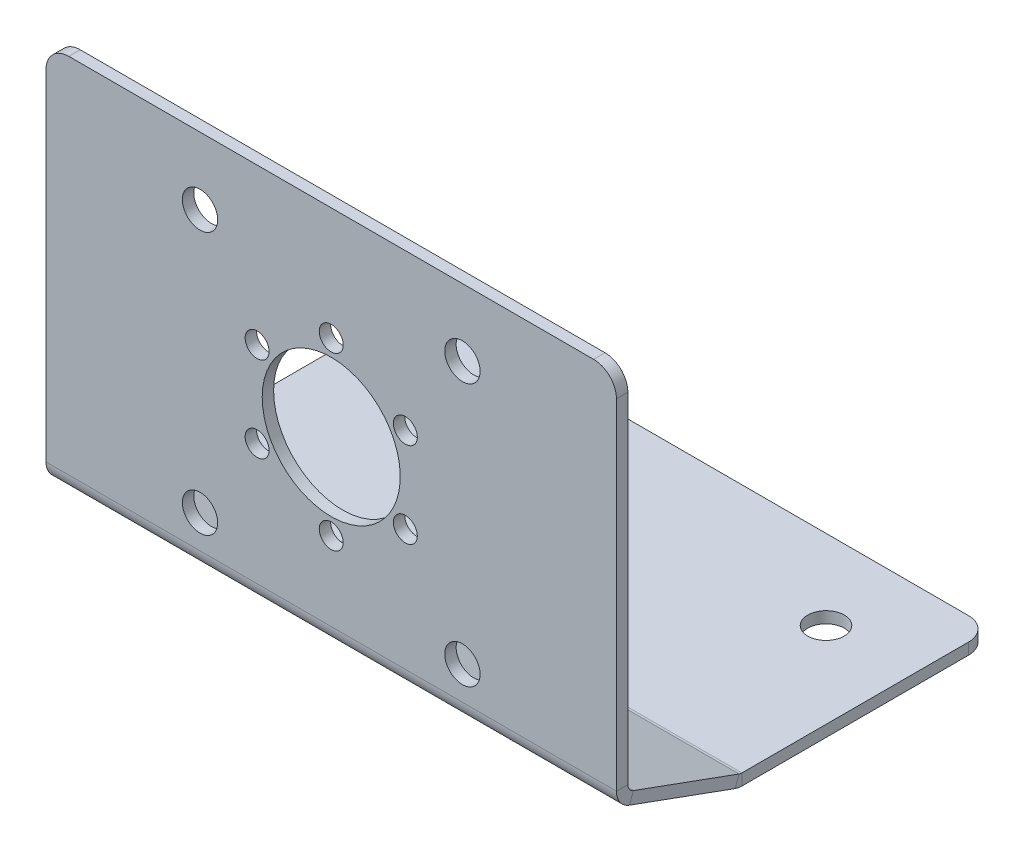
ISO-10303-21;
HEADER;
FILE_DESCRIPTION(('STEP AP214'),'2;1');
FILE_NAME('part.step','',(''),(''),'','','');
FILE_SCHEMA(('AUTOMOTIVE_DESIGN { 1 0 10303 214 1 1 1 1 }'));
ENDSEC;
DATA;
#1=APPLICATION_CONTEXT('core data for automotive mechanical design processes');
#2=APPLICATION_PROTOCOL_DEFINITION('international standard','automotive_design',2000,#1);
#3=PRODUCT_CONTEXT('',#1,'mechanical');
#4=PRODUCT('Part','Part','',(#3));
#5=PRODUCT_RELATED_PRODUCT_CATEGORY('part','',(#4));
#6=PRODUCT_DEFINITION_FORMATION('','',#4);
#7=PRODUCT_DEFINITION_CONTEXT('part definition',#1,'design');
#8=PRODUCT_DEFINITION('design','',#6,#7);
#9=PRODUCT_DEFINITION_SHAPE('','',#8);
#10=(LENGTH_UNIT() NAMED_UNIT(*) SI_UNIT(.MILLI.,.METRE.));
#11=(NAMED_UNIT(*) PLANE_ANGLE_UNIT() SI_UNIT($,.RADIAN.));
#12=(NAMED_UNIT(*) SI_UNIT($,.STERADIAN.) SOLID_ANGLE_UNIT());
#13=UNCERTAINTY_MEASURE_WITH_UNIT(LENGTH_MEASURE(1.E-05),#10,'distance_accuracy_value','');
#14=(GEOMETRIC_REPRESENTATION_CONTEXT(3) GLOBAL_UNCERTAINTY_ASSIGNED_CONTEXT((#13)) GLOBAL_UNIT_ASSIGNED_CONTEXT((#10,
#11,#12)) REPRESENTATION_CONTEXT('',''));
#15=CARTESIAN_POINT('',(0.,0.,0.));
#16=DIRECTION('',(0.,0.,1.));
#17=DIRECTION('',(1.,0.,0.));
#18=AXIS2_PLACEMENT_3D('',#15,#16,#17);
#19=CARTESIAN_POINT('',(-25.,-0.93969262078591,11.3420201433257));
#20=DIRECTION('',(1.,0.,0.));
#21=DIRECTION('',(0.,0.,-1.));
#22=AXIS2_PLACEMENT_3D('',#19,#20,#21);
#23=PLANE('',#22);
#24=DIRECTION('',(0.,-0.93969262078591,0.342020143325665));
#25=VECTOR('',#24,1.);
#26=CARTESIAN_POINT('',(-25.,3.41480679309383,20.3821045558257));
#27=LINE('',#26,#25);
#28=CARTESIAN_POINT('',(-25.,3.41480679309383,20.3821045558257));
#29=VERTEX_POINT('',#28);
#30=CARTESIAN_POINT('',(-25.,2.47511417230793,20.7241246991514));
#31=VERTEX_POINT('',#30);
#32=EDGE_CURVE('E248',#29,#31,#27,.T.);
#33=ORIENTED_EDGE('',*,*,#32,.F.);
#34=DIRECTION('',(0.,-0.342020143325663,-0.939692620785911));
#35=VECTOR('',#34,1.);
#36=CARTESIAN_POINT('',(-25.,0.,11.));
#37=LINE('',#36,#35);
#38=CARTESIAN_POINT('',(-25.,0.0444224155290982,11.1220495835838));
#39=VERTEX_POINT('',#38);
#40=EDGE_CURVE('E269',#29,#39,#37,.T.);
#41=ORIENTED_EDGE('',*,*,#40,.T.);
#42=DIRECTION('',(0.,-0.93969262078591,0.342020143325663));
#43=VECTOR('',#42,1.);
#44=CARTESIAN_POINT('',(-25.,0.0444224155290987,11.1220495835838));
#45=LINE('',#44,#43);
#46=CARTESIAN_POINT('',(-25.,-0.895270205256812,11.4640697269095));
#47=VERTEX_POINT('',#46);
#48=EDGE_CURVE('E252',#39,#47,#45,.T.);
#49=ORIENTED_EDGE('',*,*,#48,.T.);
#50=DIRECTION('',(0.,-0.342020143325663,-0.939692620785911));
#51=VECTOR('',#50,1.);
#52=CARTESIAN_POINT('',(-25.,-0.93969262078591,11.3420201433257));
#53=LINE('',#52,#51);
#54=EDGE_CURVE('E270',#31,#47,#53,.T.);
#55=ORIENTED_EDGE('',*,*,#54,.F.);
#56=EDGE_LOOP('',(#33,#41,#49,#55));
#57=FACE_BOUND('',#56,.T.);
#58=ADVANCED_FACE('F64',(#57),#23,.F.);
#59=CARTESIAN_POINT('',(25.,2.65151888413355,21.2087926615777));
#60=DIRECTION('',(-1.,0.,0.));
#61=DIRECTION('',(0.,0.,1.));
#62=AXIS2_PLACEMENT_3D('',#59,#60,#61);
#63=PLANE('',#62);
#64=DIRECTION('',(0.,-0.93969262078591,0.342020143325665));
#65=VECTOR('',#64,1.);
#66=CARTESIAN_POINT('',(25.,3.41480679309383,20.3821045558257));
#67=LINE('',#66,#65);
#68=CARTESIAN_POINT('',(25.,3.41480679309384,20.3821045558257));
#69=VERTEX_POINT('',#68);
#70=CARTESIAN_POINT('',(25.,2.47511417230792,20.7241246991514));
#71=VERTEX_POINT('',#70);
#72=EDGE_CURVE('E237',#69,#71,#67,.T.);
#73=ORIENTED_EDGE('',*,*,#72,.T.);
#74=DIRECTION('',(0.,0.342020143325663,0.939692620785911));
#75=VECTOR('',#74,1.);
#76=CARTESIAN_POINT('',(25.,2.65151888413355,21.2087926615777));
#77=LINE('',#76,#75);
#78=CARTESIAN_POINT('',(25.,-0.895270205256812,11.4640697269095));
#79=VERTEX_POINT('',#78);
#80=EDGE_CURVE('E273',#79,#71,#77,.T.);
#81=ORIENTED_EDGE('',*,*,#80,.F.);
#82=DIRECTION('',(0.,-0.93969262078591,0.342020143325663));
#83=VECTOR('',#82,1.);
#84=CARTESIAN_POINT('',(25.,0.0444224155290987,11.1220495835838));
#85=LINE('',#84,#83);
#86=CARTESIAN_POINT('',(25.,0.0444224155291019,11.1220495835838));
#87=VERTEX_POINT('',#86);
#88=EDGE_CURVE('E259',#87,#79,#85,.T.);
#89=ORIENTED_EDGE('',*,*,#88,.F.);
#90=DIRECTION('',(0.,0.342020143325663,0.939692620785911));
#91=VECTOR('',#90,1.);
#92=CARTESIAN_POINT('',(25.,3.59121150491946,20.8667725182521));
#93=LINE('',#92,#91);
#94=EDGE_CURVE('E274',#87,#69,#93,.T.);
#95=ORIENTED_EDGE('',*,*,#94,.T.);
#96=EDGE_LOOP('',(#73,#81,#89,#95));
#97=FACE_BOUND('',#96,.T.);
#98=ADVANCED_FACE('F544',(#97),#63,.F.);
#99=CARTESIAN_POINT('',(0.,-4.47502447406183,1.62877570617124));
#100=DIRECTION('',(0.,0.939692620785911,-0.342020143325663));
#101=DIRECTION('',(0.,0.342020143325663,0.939692620785911));
#102=AXIS2_PLACEMENT_3D('',#99,#100,#101);
#103=PLANE('',#102);
#104=DIRECTION('',(1.,0.,0.));
#105=VECTOR('',#104,1.);
#106=CARTESIAN_POINT('',(25.,2.47511417230792,20.7241246991514));
#107=LINE('',#106,#105);
#108=EDGE_CURVE('E189',#71,#31,#107,.F.);
#109=ORIENTED_EDGE('',*,*,#108,.T.);
#110=ORIENTED_EDGE('',*,*,#54,.T.);
#111=DIRECTION('',(-1.,0.,0.));
#112=VECTOR('',#111,1.);
#113=CARTESIAN_POINT('',(0.,-0.895270205256813,11.4640697269095));
#114=LINE('',#113,#112);
#115=EDGE_CURVE('E263',#79,#47,#114,.T.);
#116=ORIENTED_EDGE('',*,*,#115,.F.);
#117=ORIENTED_EDGE('',*,*,#80,.T.);
#118=EDGE_LOOP('',(#109,#110,#116,#117));
#119=FACE_BOUND('',#118,.T.);
#120=ADVANCED_FACE('F550',(#119),#103,.F.);
#121=CARTESIAN_POINT('',(0.,-3.53533185327592,1.28675556284558));
#122=DIRECTION('',(0.,0.939692620785911,-0.342020143325663));
#123=DIRECTION('',(0.,0.342020143325663,0.939692620785911));
#124=AXIS2_PLACEMENT_3D('',#121,#122,#123);
#125=PLANE('',#124);
#126=ORIENTED_EDGE('',*,*,#40,.F.);
#127=DIRECTION('',(1.,0.,0.));
#128=VECTOR('',#127,1.);
#129=CARTESIAN_POINT('',(25.,3.41480679309383,20.3821045558257));
#130=LINE('',#129,#128);
#131=EDGE_CURVE('E242',#69,#29,#130,.F.);
#132=ORIENTED_EDGE('',*,*,#131,.F.);
#133=ORIENTED_EDGE('',*,*,#94,.F.);
#134=DIRECTION('',(1.,0.,0.));
#135=VECTOR('',#134,1.);
#136=CARTESIAN_POINT('',(-25.,0.0444224155290987,11.1220495835838));
#137=LINE('',#136,#135);
#138=EDGE_CURVE('E256',#39,#87,#137,.T.);
#139=ORIENTED_EDGE('',*,*,#138,.F.);
#140=EDGE_LOOP('',(#126,#132,#133,#139));
#141=FACE_BOUND('',#140,.T.);
#142=ADVANCED_FACE('F603',(#141),#125,.T.);
#143=CARTESIAN_POINT('',(25.,-1.,-11.));
#144=DIRECTION('',(1.,0.,0.));
#145=DIRECTION('',(0.,0.,-1.));
#146=AXIS2_PLACEMENT_3D('',#143,#144,#145);
#147=PLANE('',#146);
#148=DIRECTION('',(0.,0.,-1.));
#149=VECTOR('',#148,1.);
#150=CARTESIAN_POINT('',(25.,-1.,-11.));
#151=LINE('',#150,#149);
#152=CARTESIAN_POINT('',(25.,-0.999999999999996,10.8701175460101));
#153=VERTEX_POINT('',#152);
#154=CARTESIAN_POINT('',(25.,-1.,-9.));
#155=VERTEX_POINT('',#154);
#156=EDGE_CURVE('E339',#153,#155,#151,.T.);
#157=ORIENTED_EDGE('',*,*,#156,.T.);
#158=DIRECTION('',(0.,1.,0.));
#159=VECTOR('',#158,1.);
#160=CARTESIAN_POINT('',(25.,-1.,-9.));
#161=LINE('',#160,#159);
#162=CARTESIAN_POINT('',(25.,0.,-9.));
#163=VERTEX_POINT('',#162);
#164=EDGE_CURVE('E351',#155,#163,#161,.T.);
#165=ORIENTED_EDGE('',*,*,#164,.T.);
#166=DIRECTION('',(0.,0.,-1.));
#167=VECTOR('',#166,1.);
#168=CARTESIAN_POINT('',(25.,0.,-11.));
#169=LINE('',#168,#167);
#170=CARTESIAN_POINT('',(25.,0.,10.8701175460101));
#171=VERTEX_POINT('',#170);
#172=EDGE_CURVE('E335',#171,#163,#169,.T.);
#173=ORIENTED_EDGE('',*,*,#172,.F.);
#174=DIRECTION('',(0.,-1.,0.));
#175=VECTOR('',#174,1.);
#176=CARTESIAN_POINT('',(25.,0.,10.8701175460101));
#177=LINE('',#176,#175);
#178=EDGE_CURVE('E292',#171,#153,#177,.T.);
#179=ORIENTED_EDGE('',*,*,#178,.T.);
#180=EDGE_LOOP('',(#157,#165,#173,#179));
#181=FACE_BOUND('',#180,.T.);
#182=ADVANCED_FACE('F589',(#181),#147,.T.);
#183=CARTESIAN_POINT('',(0.,-1.,0.));
#184=DIRECTION('',(0.,1.,0.));
#185=DIRECTION('',(0.,0.,1.));
#186=AXIS2_PLACEMENT_3D('',#183,#184,#185);
#187=PLANE('',#186);
#188=CARTESIAN_POINT('',(0.,-1.,7.5));
#189=DIRECTION('',(0.,1.,0.));
#190=DIRECTION('',(0.,0.,1.));
#191=AXIS2_PLACEMENT_3D('',#188,#189,#190);
#192=CIRCLE('',#191,1.6);
#193=CARTESIAN_POINT('',(0.,-1.,9.1));
#194=VERTEX_POINT('',#193);
#195=EDGE_CURVE('E331',#194,#194,#192,.T.);
#196=ORIENTED_EDGE('',*,*,#195,.T.);
#197=EDGE_LOOP('',(#196));
#198=FACE_BOUND('',#197,.T.);
#199=CARTESIAN_POINT('',(-17.5,-1.,-4.));
#200=DIRECTION('',(0.,1.,0.));
#201=DIRECTION('',(0.,0.,1.));
#202=AXIS2_PLACEMENT_3D('',#199,#200,#201);
#203=CIRCLE('',#202,1.6);
#204=CARTESIAN_POINT('',(-17.5,-1.,-2.4));
#205=VERTEX_POINT('',#204);
#206=EDGE_CURVE('E323',#205,#205,#203,.T.);
#207=ORIENTED_EDGE('',*,*,#206,.T.);
#208=EDGE_LOOP('',(#207));
#209=FACE_BOUND('',#208,.T.);
#210=CARTESIAN_POINT('',(17.5,-1.,-4.));
#211=DIRECTION('',(0.,1.,0.));
#212=DIRECTION('',(0.,0.,-1.));
#213=AXIS2_PLACEMENT_3D('',#210,#211,#212);
#214=CIRCLE('',#213,1.6);
#215=CARTESIAN_POINT('',(17.5,-1.,-5.6));
#216=VERTEX_POINT('',#215);
#217=EDGE_CURVE('E315',#216,#216,#214,.T.);
#218=ORIENTED_EDGE('',*,*,#217,.T.);
#219=EDGE_LOOP('',(#218));
#220=FACE_BOUND('',#219,.T.);
#221=DIRECTION('',(-1.,0.,0.));
#222=VECTOR('',#221,1.);
#223=CARTESIAN_POINT('',(-25.,-1.,-11.));
#224=LINE('',#223,#222);
#225=CARTESIAN_POINT('',(23.,-1.,-11.));
#226=VERTEX_POINT('',#225);
#227=CARTESIAN_POINT('',(-23.,-1.,-11.));
#228=VERTEX_POINT('',#227);
#229=EDGE_CURVE('E343',#226,#228,#224,.T.);
#230=ORIENTED_EDGE('',*,*,#229,.F.);
#231=CARTESIAN_POINT('',(23.,-1.,-9.));
#232=DIRECTION('',(0.,1.,0.));
#233=DIRECTION('',(0.,0.,1.));
#234=AXIS2_PLACEMENT_3D('',#231,#232,#233);
#235=CIRCLE('',#234,2.);
#236=EDGE_CURVE('E380',#226,#155,#235,.F.);
#237=ORIENTED_EDGE('',*,*,#236,.T.);
#238=ORIENTED_EDGE('',*,*,#156,.F.);
#239=DIRECTION('',(1.,0.,0.));
#240=VECTOR('',#239,1.);
#241=CARTESIAN_POINT('',(25.,-0.999999999999996,10.8701175460101));
#242=LINE('',#241,#240);
#243=CARTESIAN_POINT('',(-25.,-1.,10.8701175460101));
#244=VERTEX_POINT('',#243);
#245=EDGE_CURVE('E283',#153,#244,#242,.F.);
#246=ORIENTED_EDGE('',*,*,#245,.T.);
#247=DIRECTION('',(0.,0.,1.));
#248=VECTOR('',#247,1.);
#249=CARTESIAN_POINT('',(-25.,-1.,-11.));
#250=LINE('',#249,#248);
#251=CARTESIAN_POINT('',(-25.,-1.,-9.));
#252=VERTEX_POINT('',#251);
#253=EDGE_CURVE('E348',#252,#244,#250,.T.);
#254=ORIENTED_EDGE('',*,*,#253,.F.);
#255=CARTESIAN_POINT('',(-23.,-1.,-9.));
#256=DIRECTION('',(0.,1.,0.));
#257=DIRECTION('',(0.,0.,1.));
#258=AXIS2_PLACEMENT_3D('',#255,#256,#257);
#259=CIRCLE('',#258,2.);
#260=EDGE_CURVE('E377',#252,#228,#259,.F.);
#261=ORIENTED_EDGE('',*,*,#260,.T.);
#262=EDGE_LOOP('',(#230,#237,#238,#246,#254,#261));
#263=FACE_BOUND('',#262,.T.);
#264=ADVANCED_FACE('F585',(#198,#209,#220,#263),#187,.F.);
#265=CARTESIAN_POINT('',(0.,0.,0.));
#266=DIRECTION('',(0.,1.,0.));
#267=DIRECTION('',(0.,0.,1.));
#268=AXIS2_PLACEMENT_3D('',#265,#266,#267);
#269=PLANE('',#268);
#270=CARTESIAN_POINT('',(17.5,0.,-4.));
#271=DIRECTION('',(0.,1.,0.));
#272=DIRECTION('',(0.,0.,-1.));
#273=AXIS2_PLACEMENT_3D('',#270,#271,#272);
#274=CIRCLE('',#273,1.6);
#275=CARTESIAN_POINT('',(17.5,0.,-5.6));
#276=VERTEX_POINT('',#275);
#277=EDGE_CURVE('E311',#276,#276,#274,.T.);
#278=ORIENTED_EDGE('',*,*,#277,.F.);
#279=EDGE_LOOP('',(#278));
#280=FACE_BOUND('',#279,.T.);
#281=CARTESIAN_POINT('',(-17.5,0.,-4.));
#282=DIRECTION('',(0.,1.,0.));
#283=DIRECTION('',(0.,0.,1.));
#284=AXIS2_PLACEMENT_3D('',#281,#282,#283);
#285=CIRCLE('',#284,1.6);
#286=CARTESIAN_POINT('',(-17.5,0.,-2.4));
#287=VERTEX_POINT('',#286);
#288=EDGE_CURVE('E319',#287,#287,#285,.T.);
#289=ORIENTED_EDGE('',*,*,#288,.F.);
#290=EDGE_LOOP('',(#289));
#291=FACE_BOUND('',#290,.T.);
#292=CARTESIAN_POINT('',(0.,0.,7.5));
#293=DIRECTION('',(0.,1.,0.));
#294=DIRECTION('',(0.,0.,1.));
#295=AXIS2_PLACEMENT_3D('',#292,#293,#294);
#296=CIRCLE('',#295,1.6);
#297=CARTESIAN_POINT('',(0.,0.,9.1));
#298=VERTEX_POINT('',#297);
#299=EDGE_CURVE('E327',#298,#298,#296,.T.);
#300=ORIENTED_EDGE('',*,*,#299,.F.);
#301=EDGE_LOOP('',(#300));
#302=FACE_BOUND('',#301,.T.);
#303=ORIENTED_EDGE('',*,*,#172,.T.);
#304=CARTESIAN_POINT('',(23.,0.,-9.));
#305=DIRECTION('',(0.,1.,0.));
#306=DIRECTION('',(0.,0.,1.));
#307=AXIS2_PLACEMENT_3D('',#304,#305,#306);
#308=CIRCLE('',#307,2.);
#309=CARTESIAN_POINT('',(23.,0.,-11.));
#310=VERTEX_POINT('',#309);
#311=EDGE_CURVE('E367',#163,#310,#308,.T.);
#312=ORIENTED_EDGE('',*,*,#311,.T.);
#313=DIRECTION('',(-1.,0.,0.));
#314=VECTOR('',#313,1.);
#315=CARTESIAN_POINT('',(-25.,0.,-11.));
#316=LINE('',#315,#314);
#317=CARTESIAN_POINT('',(-23.,0.,-11.));
#318=VERTEX_POINT('',#317);
#319=EDGE_CURVE('E355',#310,#318,#316,.T.);
#320=ORIENTED_EDGE('',*,*,#319,.T.);
#321=CARTESIAN_POINT('',(-23.,0.,-9.));
#322=DIRECTION('',(0.,1.,0.));
#323=DIRECTION('',(0.,0.,1.));
#324=AXIS2_PLACEMENT_3D('',#321,#322,#323);
#325=CIRCLE('',#324,2.);
#326=CARTESIAN_POINT('',(-25.,0.,-9.));
#327=VERTEX_POINT('',#326);
#328=EDGE_CURVE('E364',#318,#327,#325,.T.);
#329=ORIENTED_EDGE('',*,*,#328,.T.);
#330=DIRECTION('',(0.,0.,1.));
#331=VECTOR('',#330,1.);
#332=CARTESIAN_POINT('',(-25.,0.,-11.));
#333=LINE('',#332,#331);
#334=CARTESIAN_POINT('',(-25.,0.,10.8701175460101));
#335=VERTEX_POINT('',#334);
#336=EDGE_CURVE('E344',#327,#335,#333,.T.);
#337=ORIENTED_EDGE('',*,*,#336,.T.);
#338=DIRECTION('',(1.,0.,0.));
#339=VECTOR('',#338,1.);
#340=CARTESIAN_POINT('',(25.,0.,10.8701175460101));
#341=LINE('',#340,#339);
#342=EDGE_CURVE('E300',#171,#335,#341,.F.);
#343=ORIENTED_EDGE('',*,*,#342,.F.);
#344=EDGE_LOOP('',(#303,#312,#320,#329,#337,#343));
#345=FACE_BOUND('',#344,.T.);
#346=ADVANCED_FACE('F588',(#280,#291,#302,#345),#269,.T.);
#347=CARTESIAN_POINT('',(-25.,-1.,-11.));
#348=DIRECTION('',(-1.,0.,0.));
#349=DIRECTION('',(0.,0.,1.));
#350=AXIS2_PLACEMENT_3D('',#347,#348,#349);
#351=PLANE('',#350);
#352=ORIENTED_EDGE('',*,*,#336,.F.);
#353=DIRECTION('',(0.,1.,0.));
#354=VECTOR('',#353,1.);
#355=CARTESIAN_POINT('',(-25.,-1.,-9.));
#356=LINE('',#355,#354);
#357=EDGE_CURVE('E383',#327,#252,#356,.F.);
#358=ORIENTED_EDGE('',*,*,#357,.T.);
#359=ORIENTED_EDGE('',*,*,#253,.T.);
#360=DIRECTION('',(0.,-1.,0.));
#361=VECTOR('',#360,1.);
#362=CARTESIAN_POINT('',(-25.,0.,10.8701175460101));
#363=LINE('',#362,#361);
#364=EDGE_CURVE('E307',#335,#244,#363,.T.);
#365=ORIENTED_EDGE('',*,*,#364,.F.);
#366=EDGE_LOOP('',(#352,#358,#359,#365));
#367=FACE_BOUND('',#366,.T.);
#368=ADVANCED_FACE('F593',(#367),#351,.T.);
#369=CARTESIAN_POINT('',(-25.,-1.,-11.));
#370=DIRECTION('',(0.,0.,-1.));
#371=DIRECTION('',(-1.,0.,0.));
#372=AXIS2_PLACEMENT_3D('',#369,#370,#371);
#373=PLANE('',#372);
#374=ORIENTED_EDGE('',*,*,#319,.F.);
#375=DIRECTION('',(0.,1.,0.));
#376=VECTOR('',#375,1.);
#377=CARTESIAN_POINT('',(23.,-1.,-11.));
#378=LINE('',#377,#376);
#379=EDGE_CURVE('E374',#310,#226,#378,.F.);
#380=ORIENTED_EDGE('',*,*,#379,.T.);
#381=ORIENTED_EDGE('',*,*,#229,.T.);
#382=DIRECTION('',(0.,1.,0.));
#383=VECTOR('',#382,1.);
#384=CARTESIAN_POINT('',(-23.,-1.,-11.));
#385=LINE('',#384,#383);
#386=EDGE_CURVE('E370',#228,#318,#385,.T.);
#387=ORIENTED_EDGE('',*,*,#386,.T.);
#388=EDGE_LOOP('',(#374,#380,#381,#387));
#389=FACE_BOUND('',#388,.T.);
#390=ADVANCED_FACE('F583',(#389),#373,.T.);
#391=CARTESIAN_POINT('',(0.,-1.,7.5));
#392=DIRECTION('',(0.,1.,0.));
#393=DIRECTION('',(0.,0.,1.));
#394=AXIS2_PLACEMENT_3D('',#391,#392,#393);
#395=CYLINDRICAL_SURFACE('',#394,1.6);
#396=ORIENTED_EDGE('',*,*,#195,.F.);
#397=EDGE_LOOP('',(#396));
#398=FACE_BOUND('',#397,.T.);
#399=ORIENTED_EDGE('',*,*,#299,.T.);
#400=EDGE_LOOP('',(#399));
#401=FACE_BOUND('',#400,.T.);
#402=ADVANCED_FACE('F579',(#398,#401),#395,.F.);
#403=CARTESIAN_POINT('',(-17.5,-1.,-4.));
#404=DIRECTION('',(0.,1.,0.));
#405=DIRECTION('',(0.,0.,1.));
#406=AXIS2_PLACEMENT_3D('',#403,#404,#405);
#407=CYLINDRICAL_SURFACE('',#406,1.6);
#408=ORIENTED_EDGE('',*,*,#206,.F.);
#409=EDGE_LOOP('',(#408));
#410=FACE_BOUND('',#409,.T.);
#411=ORIENTED_EDGE('',*,*,#288,.T.);
#412=EDGE_LOOP('',(#411));
#413=FACE_BOUND('',#412,.T.);
#414=ADVANCED_FACE('F575',(#410,#413),#407,.F.);
#415=CARTESIAN_POINT('',(17.5,-1.,-4.));
#416=DIRECTION('',(0.,1.,0.));
#417=DIRECTION('',(0.,0.,1.));
#418=AXIS2_PLACEMENT_3D('',#415,#416,#417);
#419=CYLINDRICAL_SURFACE('',#418,1.6);
#420=ORIENTED_EDGE('',*,*,#217,.F.);
#421=EDGE_LOOP('',(#420));
#422=FACE_BOUND('',#421,.T.);
#423=ORIENTED_EDGE('',*,*,#277,.T.);
#424=EDGE_LOOP('',(#423));
#425=FACE_BOUND('',#424,.T.);
#426=ADVANCED_FACE('F568',(#422,#425),#419,.F.);
#427=CARTESIAN_POINT('',(-25.,0.736599999999999,10.8701175460101));
#428=DIRECTION('',(-1.,0.,0.));
#429=DIRECTION('',(0.,-1.,0.));
#430=AXIS2_PLACEMENT_3D('',#427,#428,#429);
#431=PLANE('',#430);
#432=ORIENTED_EDGE('',*,*,#48,.F.);
#433=CARTESIAN_POINT('',(-25.,0.736599999999999,10.8701175460101));
#434=DIRECTION('',(1.,0.,0.));
#435=DIRECTION('',(0.,1.,0.));
#436=AXIS2_PLACEMENT_3D('',#433,#434,#435);
#437=CIRCLE('',#436,0.736599999999999);
#438=EDGE_CURVE('E296',#335,#39,#437,.F.);
#439=ORIENTED_EDGE('',*,*,#438,.F.);
#440=ORIENTED_EDGE('',*,*,#364,.T.);
#441=CARTESIAN_POINT('',(-25.,0.736599999999999,10.8701175460101));
#442=DIRECTION('',(1.,0.,0.));
#443=DIRECTION('',(0.,1.,0.));
#444=AXIS2_PLACEMENT_3D('',#441,#442,#443);
#445=CIRCLE('',#444,1.7366);
#446=EDGE_CURVE('E287',#244,#47,#445,.F.);
#447=ORIENTED_EDGE('',*,*,#446,.T.);
#448=EDGE_LOOP('',(#432,#439,#440,#447));
#449=FACE_BOUND('',#448,.T.);
#450=ADVANCED_FACE('F565',(#449),#431,.T.);
#451=CARTESIAN_POINT('',(25.,0.736600000000003,10.8701175460101));
#452=DIRECTION('',(-1.,0.,0.));
#453=DIRECTION('',(0.,-1.,0.));
#454=AXIS2_PLACEMENT_3D('',#451,#452,#453);
#455=PLANE('',#454);
#456=CARTESIAN_POINT('',(25.,0.736600000000003,10.8701175460101));
#457=DIRECTION('',(1.,0.,0.));
#458=DIRECTION('',(0.,1.,0.));
#459=AXIS2_PLACEMENT_3D('',#456,#457,#458);
#460=CIRCLE('',#459,0.736599999999999);
#461=EDGE_CURVE('E277',#87,#171,#460,.T.);
#462=ORIENTED_EDGE('',*,*,#461,.F.);
#463=ORIENTED_EDGE('',*,*,#88,.T.);
#464=CARTESIAN_POINT('',(25.,0.736600000000003,10.8701175460101));
#465=DIRECTION('',(1.,0.,0.));
#466=DIRECTION('',(0.,1.,0.));
#467=AXIS2_PLACEMENT_3D('',#464,#465,#466);
#468=CIRCLE('',#467,1.7366);
#469=EDGE_CURVE('E288',#79,#153,#468,.T.);
#470=ORIENTED_EDGE('',*,*,#469,.T.);
#471=ORIENTED_EDGE('',*,*,#178,.F.);
#472=EDGE_LOOP('',(#462,#463,#470,#471));
#473=FACE_BOUND('',#472,.T.);
#474=ADVANCED_FACE('F559',(#473),#455,.F.);
#475=CARTESIAN_POINT('',(25.,0.736600000000003,10.8701175460101));
#476=DIRECTION('',(1.,0.,0.));
#477=DIRECTION('',(0.,-0.939692620785911,0.342020143325663));
#478=AXIS2_PLACEMENT_3D('',#475,#476,#477);
#479=CYLINDRICAL_SURFACE('',#478,1.7366);
#480=ORIENTED_EDGE('',*,*,#245,.F.);
#481=ORIENTED_EDGE('',*,*,#469,.F.);
#482=ORIENTED_EDGE('',*,*,#115,.T.);
#483=ORIENTED_EDGE('',*,*,#446,.F.);
#484=EDGE_LOOP('',(#480,#481,#482,#483));
#485=FACE_BOUND('',#484,.T.);
#486=ADVANCED_FACE('F555',(#485),#479,.T.);
#487=CARTESIAN_POINT('',(25.,0.736600000000003,10.8701175460101));
#488=DIRECTION('',(1.,0.,0.));
#489=DIRECTION('',(0.,-0.939692620785911,0.342020143325663));
#490=AXIS2_PLACEMENT_3D('',#487,#488,#489);
#491=CYLINDRICAL_SURFACE('',#490,0.736599999999999);
#492=ORIENTED_EDGE('',*,*,#342,.T.);
#493=ORIENTED_EDGE('',*,*,#438,.T.);
#494=ORIENTED_EDGE('',*,*,#138,.T.);
#495=ORIENTED_EDGE('',*,*,#461,.T.);
#496=EDGE_LOOP('',(#492,#493,#494,#495));
#497=FACE_BOUND('',#496,.T.);
#498=ADVANCED_FACE('F558',(#497),#491,.F.);
#499=CARTESIAN_POINT('',(-25.,4.10698437756473,20.1301725182521));
#500=DIRECTION('',(-1.,0.,0.));
#501=DIRECTION('',(0.,0.,1.));
#502=AXIS2_PLACEMENT_3D('',#499,#500,#501);
#503=PLANE('',#502);
#504=DIRECTION('',(0.,0.,1.));
#505=VECTOR('',#504,1.);
#506=CARTESIAN_POINT('',(-25.,4.10698437756473,20.8667725182521));
#507=LINE('',#506,#505);
#508=CARTESIAN_POINT('',(-25.,4.10698437756473,20.8667725182521));
#509=VERTEX_POINT('',#508);
#510=CARTESIAN_POINT('',(-25.,4.10698437756473,21.8667725182521));
#511=VERTEX_POINT('',#510);
#512=EDGE_CURVE('E424',#509,#511,#507,.T.);
#513=ORIENTED_EDGE('',*,*,#512,.F.);
#514=CARTESIAN_POINT('',(-25.,4.10698437756473,20.1301725182521));
#515=DIRECTION('',(1.,0.,0.));
#516=DIRECTION('',(0.,0.,-1.));
#517=AXIS2_PLACEMENT_3D('',#514,#515,#516);
#518=CIRCLE('',#517,0.736599999999997);
#519=EDGE_CURVE('E193',#29,#509,#518,.F.);
#520=ORIENTED_EDGE('',*,*,#519,.F.);
#521=ORIENTED_EDGE('',*,*,#32,.T.);
#522=CARTESIAN_POINT('',(-25.,4.10698437756473,20.1301725182521));
#523=DIRECTION('',(1.,0.,0.));
#524=DIRECTION('',(0.,0.,-1.));
#525=AXIS2_PLACEMENT_3D('',#522,#523,#524);
#526=CIRCLE('',#525,1.7366);
#527=EDGE_CURVE('E235',#31,#511,#526,.F.);
#528=ORIENTED_EDGE('',*,*,#527,.T.);
#529=EDGE_LOOP('',(#513,#520,#521,#528));
#530=FACE_BOUND('',#529,.T.);
#531=ADVANCED_FACE('F563',(#530),#503,.T.);
#532=CARTESIAN_POINT('',(25.,4.10698437756473,20.1301725182521));
#533=DIRECTION('',(-1.,0.,0.));
#534=DIRECTION('',(0.,0.,1.));
#535=AXIS2_PLACEMENT_3D('',#532,#533,#534);
#536=PLANE('',#535);
#537=CARTESIAN_POINT('',(25.,4.10698437756473,20.1301725182521));
#538=DIRECTION('',(1.,0.,0.));
#539=DIRECTION('',(0.,0.,-1.));
#540=AXIS2_PLACEMENT_3D('',#537,#538,#539);
#541=CIRCLE('',#540,0.736599999999997);
#542=CARTESIAN_POINT('',(25.,4.10698437756473,20.8667725182521));
#543=VERTEX_POINT('',#542);
#544=EDGE_CURVE('E200',#543,#69,#541,.T.);
#545=ORIENTED_EDGE('',*,*,#544,.F.);
#546=DIRECTION('',(0.,0.,1.));
#547=VECTOR('',#546,1.);
#548=CARTESIAN_POINT('',(25.,4.10698437756473,20.8667725182521));
#549=LINE('',#548,#547);
#550=CARTESIAN_POINT('',(25.,4.10698437756473,21.8667725182521));
#551=VERTEX_POINT('',#550);
#552=EDGE_CURVE('E197',#543,#551,#549,.T.);
#553=ORIENTED_EDGE('',*,*,#552,.T.);
#554=CARTESIAN_POINT('',(25.,4.10698437756473,20.1301725182521));
#555=DIRECTION('',(1.,0.,0.));
#556=DIRECTION('',(0.,0.,-1.));
#557=AXIS2_PLACEMENT_3D('',#554,#555,#556);
#558=CIRCLE('',#557,1.7366);
#559=EDGE_CURVE('E182',#551,#71,#558,.T.);
#560=ORIENTED_EDGE('',*,*,#559,.T.);
#561=ORIENTED_EDGE('',*,*,#72,.F.);
#562=EDGE_LOOP('',(#545,#553,#560,#561));
#563=FACE_BOUND('',#562,.T.);
#564=ADVANCED_FACE('F198',(#563),#536,.F.);
#565=CARTESIAN_POINT('',(25.,4.10698437756473,20.1301725182521));
#566=DIRECTION('',(1.,0.,0.));
#567=DIRECTION('',(0.,0.,1.));
#568=AXIS2_PLACEMENT_3D('',#565,#566,#567);
#569=CYLINDRICAL_SURFACE('',#568,1.7366);
#570=ORIENTED_EDGE('',*,*,#108,.F.);
#571=ORIENTED_EDGE('',*,*,#559,.F.);
#572=DIRECTION('',(-1.,0.,0.));
#573=VECTOR('',#572,1.);
#574=CARTESIAN_POINT('',(0.,4.10698437756473,21.8667725182521));
#575=LINE('',#574,#573);
#576=EDGE_CURVE('E187',#551,#511,#575,.T.);
#577=ORIENTED_EDGE('',*,*,#576,.T.);
#578=ORIENTED_EDGE('',*,*,#527,.F.);
#579=EDGE_LOOP('',(#570,#571,#577,#578));
#580=FACE_BOUND('',#579,.T.);
#581=ADVANCED_FACE('F184',(#580),#569,.T.);
#582=CARTESIAN_POINT('',(25.,4.10698437756473,20.1301725182521));
#583=DIRECTION('',(1.,0.,0.));
#584=DIRECTION('',(0.,0.,1.));
#585=AXIS2_PLACEMENT_3D('',#582,#583,#584);
#586=CYLINDRICAL_SURFACE('',#585,0.736599999999997);
#587=ORIENTED_EDGE('',*,*,#131,.T.);
#588=ORIENTED_EDGE('',*,*,#519,.T.);
#589=DIRECTION('',(1.,0.,0.));
#590=VECTOR('',#589,1.);
#591=CARTESIAN_POINT('',(-25.,4.10698437756473,20.8667725182521));
#592=LINE('',#591,#590);
#593=EDGE_CURVE('E203',#509,#543,#592,.T.);
#594=ORIENTED_EDGE('',*,*,#593,.T.);
#595=ORIENTED_EDGE('',*,*,#544,.T.);
#596=EDGE_LOOP('',(#587,#588,#594,#595));
#597=FACE_BOUND('',#596,.T.);
#598=ADVANCED_FACE('F752',(#597),#586,.F.);
#599=CARTESIAN_POINT('',(25.,35.8910039667098,21.8667725182521));
#600=DIRECTION('',(-1.,0.,0.));
#601=DIRECTION('',(0.,0.,1.));
#602=AXIS2_PLACEMENT_3D('',#599,#600,#601);
#603=PLANE('',#602);
#604=DIRECTION('',(0.,1.,0.));
#605=VECTOR('',#604,1.);
#606=CARTESIAN_POINT('',(25.,35.8910039667098,20.8667725182521));
#607=LINE('',#606,#605);
#608=CARTESIAN_POINT('',(25.,33.8910039667098,20.8667725182521));
#609=VERTEX_POINT('',#608);
#610=EDGE_CURVE('E210',#543,#609,#607,.T.);
#611=ORIENTED_EDGE('',*,*,#610,.T.);
#612=DIRECTION('',(0.,0.,-1.));
#613=VECTOR('',#612,1.);
#614=CARTESIAN_POINT('',(25.,33.8910039667098,21.8667725182521));
#615=LINE('',#614,#613);
#616=CARTESIAN_POINT('',(25.,33.8910039667098,21.8667725182521));
#617=VERTEX_POINT('',#616);
#618=EDGE_CURVE('E88',#609,#617,#615,.F.);
#619=ORIENTED_EDGE('',*,*,#618,.T.);
#620=DIRECTION('',(0.,1.,0.));
#621=VECTOR('',#620,1.);
#622=CARTESIAN_POINT('',(25.,35.8910039667098,21.8667725182521));
#623=LINE('',#622,#621);
#624=EDGE_CURVE('E206',#551,#617,#623,.T.);
#625=ORIENTED_EDGE('',*,*,#624,.F.);
#626=ORIENTED_EDGE('',*,*,#552,.F.);
#627=EDGE_LOOP('',(#611,#619,#625,#626));
#628=FACE_BOUND('',#627,.T.);
#629=ADVANCED_FACE('F212',(#628),#603,.F.);
#630=CARTESIAN_POINT('',(-25.,3.59121150491946,21.8667725182521));
#631=DIRECTION('',(1.,0.,0.));
#632=DIRECTION('',(0.,0.,-1.));
#633=AXIS2_PLACEMENT_3D('',#630,#631,#632);
#634=PLANE('',#633);
#635=DIRECTION('',(0.,-1.,0.));
#636=VECTOR('',#635,1.);
#637=CARTESIAN_POINT('',(-25.,3.59121150491946,21.8667725182521));
#638=LINE('',#637,#636);
#639=CARTESIAN_POINT('',(-25.,33.8910039667098,21.8667725182521));
#640=VERTEX_POINT('',#639);
#641=EDGE_CURVE('E208',#640,#511,#638,.T.);
#642=ORIENTED_EDGE('',*,*,#641,.F.);
#643=DIRECTION('',(0.,0.,-1.));
#644=VECTOR('',#643,1.);
#645=CARTESIAN_POINT('',(-25.,33.8910039667098,21.8667725182521));
#646=LINE('',#645,#644);
#647=CARTESIAN_POINT('',(-25.,33.8910039667098,20.8667725182521));
#648=VERTEX_POINT('',#647);
#649=EDGE_CURVE('E12',#640,#648,#646,.T.);
#650=ORIENTED_EDGE('',*,*,#649,.T.);
#651=DIRECTION('',(0.,-1.,0.));
#652=VECTOR('',#651,1.);
#653=CARTESIAN_POINT('',(-25.,3.59121150491946,20.8667725182521));
#654=LINE('',#653,#652);
#655=EDGE_CURVE('E215',#648,#509,#654,.T.);
#656=ORIENTED_EDGE('',*,*,#655,.T.);
#657=ORIENTED_EDGE('',*,*,#512,.T.);
#658=EDGE_LOOP('',(#642,#650,#656,#657));
#659=FACE_BOUND('',#658,.T.);
#660=ADVANCED_FACE('F419',(#659),#634,.F.);
#661=CARTESIAN_POINT('',(0.,0.,21.8667725182521));
#662=DIRECTION('',(0.,0.,-1.));
#663=DIRECTION('',(-1.,0.,0.));
#664=AXIS2_PLACEMENT_3D('',#661,#662,#663);
#665=PLANE('',#664);
#666=CARTESIAN_POINT('',(11.5,7.,21.8667725182521));
#667=DIRECTION('',(0.,0.,-1.));
#668=DIRECTION('',(-1.,0.,0.));
#669=AXIS2_PLACEMENT_3D('',#666,#667,#668);
#670=CIRCLE('',#669,1.55);
#671=CARTESIAN_POINT('',(9.95000000000001,7.,21.8667725182521));
#672=VERTEX_POINT('',#671);
#673=EDGE_CURVE('E427',#672,#672,#670,.T.);
#674=ORIENTED_EDGE('',*,*,#673,.T.);
#675=EDGE_LOOP('',(#674));
#676=FACE_BOUND('',#675,.T.);
#677=CARTESIAN_POINT('',(-11.5,7.,21.8667725182521));
#678=DIRECTION('',(0.,0.,-1.));
#679=DIRECTION('',(-1.,0.,0.));
#680=AXIS2_PLACEMENT_3D('',#677,#678,#679);
#681=CIRCLE('',#680,1.55);
#682=CARTESIAN_POINT('',(-13.05,7.,21.8667725182521));
#683=VERTEX_POINT('',#682);
#684=EDGE_CURVE('E432',#683,#683,#681,.T.);
#685=ORIENTED_EDGE('',*,*,#684,.T.);
#686=EDGE_LOOP('',(#685));
#687=FACE_BOUND('',#686,.T.);
#688=CARTESIAN_POINT('',(-11.5,30.,21.8667725182521));
#689=DIRECTION('',(0.,0.,-1.));
#690=DIRECTION('',(-1.,0.,0.));
#691=AXIS2_PLACEMENT_3D('',#688,#689,#690);
#692=CIRCLE('',#691,1.55);
#693=CARTESIAN_POINT('',(-13.05,30.,21.8667725182521));
#694=VERTEX_POINT('',#693);
#695=EDGE_CURVE('E435',#694,#694,#692,.T.);
#696=ORIENTED_EDGE('',*,*,#695,.T.);
#697=EDGE_LOOP('',(#696));
#698=FACE_BOUND('',#697,.T.);
#699=CARTESIAN_POINT('',(-6.49519052838328,22.25,21.8667725182521));
#700=DIRECTION('',(0.,0.,-1.));
#701=DIRECTION('',(-1.,0.,0.));
#702=AXIS2_PLACEMENT_3D('',#699,#700,#701);
#703=CIRCLE('',#702,1.05);
#704=CARTESIAN_POINT('',(-7.54519052838328,22.25,21.8667725182521));
#705=VERTEX_POINT('',#704);
#706=EDGE_CURVE('E439',#705,#705,#703,.T.);
#707=ORIENTED_EDGE('',*,*,#706,.T.);
#708=EDGE_LOOP('',(#707));
#709=FACE_BOUND('',#708,.T.);
#710=CARTESIAN_POINT('',(0.,26.,21.8667725182521));
#711=DIRECTION('',(0.,0.,-1.));
#712=DIRECTION('',(-1.,0.,0.));
#713=AXIS2_PLACEMENT_3D('',#710,#711,#712);
#714=CIRCLE('',#713,1.05);
#715=CARTESIAN_POINT('',(-1.05,26.,21.8667725182521));
#716=VERTEX_POINT('',#715);
#717=EDGE_CURVE('E443',#716,#716,#714,.T.);
#718=ORIENTED_EDGE('',*,*,#717,.T.);
#719=EDGE_LOOP('',(#718));
#720=FACE_BOUND('',#719,.T.);
#721=CARTESIAN_POINT('',(6.49519052838329,22.25,21.8667725182521));
#722=DIRECTION('',(0.,0.,-1.));
#723=DIRECTION('',(-1.,0.,0.));
#724=AXIS2_PLACEMENT_3D('',#721,#722,#723);
#725=CIRCLE('',#724,1.05);
#726=CARTESIAN_POINT('',(5.44519052838329,22.25,21.8667725182521));
#727=VERTEX_POINT('',#726);
#728=EDGE_CURVE('E447',#727,#727,#725,.T.);
#729=ORIENTED_EDGE('',*,*,#728,.T.);
#730=EDGE_LOOP('',(#729));
#731=FACE_BOUND('',#730,.T.);
#732=CARTESIAN_POINT('',(-6.49519052838329,14.75,21.8667725182521));
#733=DIRECTION('',(0.,0.,-1.));
#734=DIRECTION('',(-1.,0.,0.));
#735=AXIS2_PLACEMENT_3D('',#732,#733,#734);
#736=CIRCLE('',#735,1.05);
#737=CARTESIAN_POINT('',(-7.54519052838329,14.75,21.8667725182521));
#738=VERTEX_POINT('',#737);
#739=EDGE_CURVE('E450',#738,#738,#736,.T.);
#740=ORIENTED_EDGE('',*,*,#739,.T.);
#741=EDGE_LOOP('',(#740));
#742=FACE_BOUND('',#741,.T.);
#743=CARTESIAN_POINT('',(0.,18.5,21.8667725182521));
#744=DIRECTION('',(0.,0.,-1.));
#745=DIRECTION('',(-1.,0.,0.));
#746=AXIS2_PLACEMENT_3D('',#743,#744,#745);
#747=CIRCLE('',#746,6.05);
#748=CARTESIAN_POINT('',(-6.05,18.5,21.8667725182521));
#749=VERTEX_POINT('',#748);
#750=EDGE_CURVE('E454',#749,#749,#747,.T.);
#751=ORIENTED_EDGE('',*,*,#750,.T.);
#752=EDGE_LOOP('',(#751));
#753=FACE_BOUND('',#752,.T.);
#754=CARTESIAN_POINT('',(0.,11.,21.8667725182521));
#755=DIRECTION('',(0.,0.,-1.));
#756=DIRECTION('',(-1.,0.,0.));
#757=AXIS2_PLACEMENT_3D('',#754,#755,#756);
#758=CIRCLE('',#757,1.05);
#759=CARTESIAN_POINT('',(-1.05,11.,21.8667725182521));
#760=VERTEX_POINT('',#759);
#761=EDGE_CURVE('E458',#760,#760,#758,.T.);
#762=ORIENTED_EDGE('',*,*,#761,.T.);
#763=EDGE_LOOP('',(#762));
#764=FACE_BOUND('',#763,.T.);
#765=CARTESIAN_POINT('',(6.49519052838329,14.75,21.8667725182521));
#766=DIRECTION('',(0.,0.,-1.));
#767=DIRECTION('',(-1.,0.,0.));
#768=AXIS2_PLACEMENT_3D('',#765,#766,#767);
#769=CIRCLE('',#768,1.05);
#770=CARTESIAN_POINT('',(5.44519052838329,14.75,21.8667725182521));
#771=VERTEX_POINT('',#770);
#772=EDGE_CURVE('E462',#771,#771,#769,.T.);
#773=ORIENTED_EDGE('',*,*,#772,.T.);
#774=EDGE_LOOP('',(#773));
#775=FACE_BOUND('',#774,.T.);
#776=CARTESIAN_POINT('',(11.5,30.,21.8667725182521));
#777=DIRECTION('',(0.,0.,-1.));
#778=DIRECTION('',(-1.,0.,0.));
#779=AXIS2_PLACEMENT_3D('',#776,#777,#778);
#780=CIRCLE('',#779,1.55);
#781=CARTESIAN_POINT('',(9.95,30.,21.8667725182521));
#782=VERTEX_POINT('',#781);
#783=EDGE_CURVE('E466',#782,#782,#780,.T.);
#784=ORIENTED_EDGE('',*,*,#783,.T.);
#785=EDGE_LOOP('',(#784));
#786=FACE_BOUND('',#785,.T.);
#787=ORIENTED_EDGE('',*,*,#624,.T.);
#788=CARTESIAN_POINT('',(23.,33.8910039667098,21.8667725182521));
#789=DIRECTION('',(0.,0.,-1.));
#790=DIRECTION('',(-1.,0.,0.));
#791=AXIS2_PLACEMENT_3D('',#788,#789,#790);
#792=CIRCLE('',#791,2.);
#793=CARTESIAN_POINT('',(23.,35.8910039667098,21.8667725182521));
#794=VERTEX_POINT('',#793);
#795=EDGE_CURVE('E73',#617,#794,#792,.F.);
#796=ORIENTED_EDGE('',*,*,#795,.T.);
#797=DIRECTION('',(-1.,0.,0.));
#798=VECTOR('',#797,1.);
#799=CARTESIAN_POINT('',(-25.,35.8910039667098,21.8667725182521));
#800=LINE('',#799,#798);
#801=CARTESIAN_POINT('',(-23.,35.8910039667098,21.8667725182521));
#802=VERTEX_POINT('',#801);
#803=EDGE_CURVE('E214',#794,#802,#800,.T.);
#804=ORIENTED_EDGE('',*,*,#803,.T.);
#805=CARTESIAN_POINT('',(-23.,33.8910039667098,21.8667725182521));
#806=DIRECTION('',(0.,0.,-1.));
#807=DIRECTION('',(-1.,0.,0.));
#808=AXIS2_PLACEMENT_3D('',#805,#806,#807);
#809=CIRCLE('',#808,2.);
#810=EDGE_CURVE('E80',#802,#640,#809,.F.);
#811=ORIENTED_EDGE('',*,*,#810,.T.);
#812=ORIENTED_EDGE('',*,*,#641,.T.);
#813=ORIENTED_EDGE('',*,*,#576,.F.);
#814=EDGE_LOOP('',(#787,#796,#804,#811,#812,#813));
#815=FACE_BOUND('',#814,.T.);
#816=ADVANCED_FACE('F205',(#676,#687,#698,#709,#720,#731,#742,#753,#764,#775,#786,#815),#665,.F.);
#817=CARTESIAN_POINT('',(0.,0.,20.8667725182521));
#818=DIRECTION('',(0.,0.,-1.));
#819=DIRECTION('',(-1.,0.,0.));
#820=AXIS2_PLACEMENT_3D('',#817,#818,#819);
#821=PLANE('',#820);
#822=CARTESIAN_POINT('',(11.5,7.,20.8667725182521));
#823=DIRECTION('',(0.,0.,-1.));
#824=DIRECTION('',(-1.,0.,0.));
#825=AXIS2_PLACEMENT_3D('',#822,#823,#824);
#826=CIRCLE('',#825,1.55);
#827=CARTESIAN_POINT('',(9.95000000000001,7.,20.8667725182521));
#828=VERTEX_POINT('',#827);
#829=EDGE_CURVE('E475',#828,#828,#826,.T.);
#830=ORIENTED_EDGE('',*,*,#829,.F.);
#831=EDGE_LOOP('',(#830));
#832=FACE_BOUND('',#831,.T.);
#833=CARTESIAN_POINT('',(-11.5,7.,20.8667725182521));
#834=DIRECTION('',(0.,0.,-1.));
#835=DIRECTION('',(-1.,0.,0.));
#836=AXIS2_PLACEMENT_3D('',#833,#834,#835);
#837=CIRCLE('',#836,1.55);
#838=CARTESIAN_POINT('',(-13.05,7.,20.8667725182521));
#839=VERTEX_POINT('',#838);
#840=EDGE_CURVE('E479',#839,#839,#837,.T.);
#841=ORIENTED_EDGE('',*,*,#840,.F.);
#842=EDGE_LOOP('',(#841));
#843=FACE_BOUND('',#842,.T.);
#844=CARTESIAN_POINT('',(-11.5,30.,20.8667725182521));
#845=DIRECTION('',(0.,0.,-1.));
#846=DIRECTION('',(-1.,0.,0.));
#847=AXIS2_PLACEMENT_3D('',#844,#845,#846);
#848=CIRCLE('',#847,1.55);
#849=CARTESIAN_POINT('',(-13.05,30.,20.8667725182521));
#850=VERTEX_POINT('',#849);
#851=EDGE_CURVE('E474',#850,#850,#848,.T.);
#852=ORIENTED_EDGE('',*,*,#851,.F.);
#853=EDGE_LOOP('',(#852));
#854=FACE_BOUND('',#853,.T.);
#855=CARTESIAN_POINT('',(-6.49519052838328,22.25,20.8667725182521));
#856=DIRECTION('',(0.,0.,-1.));
#857=DIRECTION('',(-1.,0.,0.));
#858=AXIS2_PLACEMENT_3D('',#855,#856,#857);
#859=CIRCLE('',#858,1.05);
#860=CARTESIAN_POINT('',(-7.54519052838328,22.25,20.8667725182521));
#861=VERTEX_POINT('',#860);
#862=EDGE_CURVE('E493',#861,#861,#859,.T.);
#863=ORIENTED_EDGE('',*,*,#862,.F.);
#864=EDGE_LOOP('',(#863));
#865=FACE_BOUND('',#864,.T.);
#866=CARTESIAN_POINT('',(0.,26.,20.8667725182521));
#867=DIRECTION('',(0.,0.,-1.));
#868=DIRECTION('',(-1.,0.,0.));
#869=AXIS2_PLACEMENT_3D('',#866,#867,#868);
#870=CIRCLE('',#869,1.05);
#871=CARTESIAN_POINT('',(-1.05,26.,20.8667725182521));
#872=VERTEX_POINT('',#871);
#873=EDGE_CURVE('E488',#872,#872,#870,.T.);
#874=ORIENTED_EDGE('',*,*,#873,.F.);
#875=EDGE_LOOP('',(#874));
#876=FACE_BOUND('',#875,.T.);
#877=CARTESIAN_POINT('',(6.49519052838329,22.25,20.8667725182521));
#878=DIRECTION('',(0.,0.,-1.));
#879=DIRECTION('',(-1.,0.,0.));
#880=AXIS2_PLACEMENT_3D('',#877,#878,#879);
#881=CIRCLE('',#880,1.05);
#882=CARTESIAN_POINT('',(5.44519052838329,22.25,20.8667725182521));
#883=VERTEX_POINT('',#882);
#884=EDGE_CURVE('E484',#883,#883,#881,.T.);
#885=ORIENTED_EDGE('',*,*,#884,.F.);
#886=EDGE_LOOP('',(#885));
#887=FACE_BOUND('',#886,.T.);
#888=CARTESIAN_POINT('',(-6.49519052838329,14.75,20.8667725182521));
#889=DIRECTION('',(0.,0.,-1.));
#890=DIRECTION('',(-1.,0.,0.));
#891=AXIS2_PLACEMENT_3D('',#888,#889,#890);
#892=CIRCLE('',#891,1.05);
#893=CARTESIAN_POINT('',(-7.54519052838329,14.75,20.8667725182521));
#894=VERTEX_POINT('',#893);
#895=EDGE_CURVE('E504',#894,#894,#892,.T.);
#896=ORIENTED_EDGE('',*,*,#895,.F.);
#897=EDGE_LOOP('',(#896));
#898=FACE_BOUND('',#897,.T.);
#899=CARTESIAN_POINT('',(0.,18.5,20.8667725182521));
#900=DIRECTION('',(0.,0.,-1.));
#901=DIRECTION('',(-1.,0.,0.));
#902=AXIS2_PLACEMENT_3D('',#899,#900,#901);
#903=CIRCLE('',#902,6.05);
#904=CARTESIAN_POINT('',(-6.05,18.5,20.8667725182521));
#905=VERTEX_POINT('',#904);
#906=EDGE_CURVE('E483',#905,#905,#903,.T.);
#907=ORIENTED_EDGE('',*,*,#906,.F.);
#908=EDGE_LOOP('',(#907));
#909=FACE_BOUND('',#908,.T.);
#910=CARTESIAN_POINT('',(0.,11.,20.8667725182521));
#911=DIRECTION('',(0.,0.,-1.));
#912=DIRECTION('',(-1.,0.,0.));
#913=AXIS2_PLACEMENT_3D('',#910,#911,#912);
#914=CIRCLE('',#913,1.05);
#915=CARTESIAN_POINT('',(-1.05,11.,20.8667725182521));
#916=VERTEX_POINT('',#915);
#917=EDGE_CURVE('E500',#916,#916,#914,.T.);
#918=ORIENTED_EDGE('',*,*,#917,.F.);
#919=EDGE_LOOP('',(#918));
#920=FACE_BOUND('',#919,.T.);
#921=CARTESIAN_POINT('',(6.49519052838329,14.75,20.8667725182521));
#922=DIRECTION('',(0.,0.,-1.));
#923=DIRECTION('',(-1.,0.,0.));
#924=AXIS2_PLACEMENT_3D('',#921,#922,#923);
#925=CIRCLE('',#924,1.05);
#926=CARTESIAN_POINT('',(5.44519052838329,14.75,20.8667725182521));
#927=VERTEX_POINT('',#926);
#928=EDGE_CURVE('E489',#927,#927,#925,.T.);
#929=ORIENTED_EDGE('',*,*,#928,.F.);
#930=EDGE_LOOP('',(#929));
#931=FACE_BOUND('',#930,.T.);
#932=CARTESIAN_POINT('',(11.5,30.,20.8667725182521));
#933=DIRECTION('',(0.,0.,-1.));
#934=DIRECTION('',(-1.,0.,0.));
#935=AXIS2_PLACEMENT_3D('',#932,#933,#934);
#936=CIRCLE('',#935,1.55);
#937=CARTESIAN_POINT('',(9.95,30.,20.8667725182521));
#938=VERTEX_POINT('',#937);
#939=EDGE_CURVE('E470',#938,#938,#936,.T.);
#940=ORIENTED_EDGE('',*,*,#939,.F.);
#941=EDGE_LOOP('',(#940));
#942=FACE_BOUND('',#941,.T.);
#943=DIRECTION('',(-1.,0.,0.));
#944=VECTOR('',#943,1.);
#945=CARTESIAN_POINT('',(-25.,35.8910039667098,20.8667725182521));
#946=LINE('',#945,#944);
#947=CARTESIAN_POINT('',(23.,35.8910039667098,20.8667725182521));
#948=VERTEX_POINT('',#947);
#949=CARTESIAN_POINT('',(-23.,35.8910039667098,20.8667725182521));
#950=VERTEX_POINT('',#949);
#951=EDGE_CURVE('E222',#948,#950,#946,.T.);
#952=ORIENTED_EDGE('',*,*,#951,.F.);
#953=CARTESIAN_POINT('',(23.,33.8910039667098,20.8667725182521));
#954=DIRECTION('',(0.,0.,-1.));
#955=DIRECTION('',(-1.,0.,0.));
#956=AXIS2_PLACEMENT_3D('',#953,#954,#955);
#957=CIRCLE('',#956,2.);
#958=EDGE_CURVE('E396',#948,#609,#957,.T.);
#959=ORIENTED_EDGE('',*,*,#958,.T.);
#960=ORIENTED_EDGE('',*,*,#610,.F.);
#961=ORIENTED_EDGE('',*,*,#593,.F.);
#962=ORIENTED_EDGE('',*,*,#655,.F.);
#963=CARTESIAN_POINT('',(-23.,33.8910039667098,20.8667725182521));
#964=DIRECTION('',(0.,0.,-1.));
#965=DIRECTION('',(-1.,0.,0.));
#966=AXIS2_PLACEMENT_3D('',#963,#964,#965);
#967=CIRCLE('',#966,2.);
#968=EDGE_CURVE('E393',#648,#950,#967,.T.);
#969=ORIENTED_EDGE('',*,*,#968,.T.);
#970=EDGE_LOOP('',(#952,#959,#960,#961,#962,#969));
#971=FACE_BOUND('',#970,.T.);
#972=ADVANCED_FACE('F413',(#832,#843,#854,#865,#876,#887,#898,#909,#920,#931,#942,#971),#821,.T.);
#973=CARTESIAN_POINT('',(-25.,35.8910039667098,21.8667725182521));
#974=DIRECTION('',(0.,-1.,0.));
#975=DIRECTION('',(0.,0.,-1.));
#976=AXIS2_PLACEMENT_3D('',#973,#974,#975);
#977=PLANE('',#976);
#978=ORIENTED_EDGE('',*,*,#803,.F.);
#979=DIRECTION('',(0.,0.,-1.));
#980=VECTOR('',#979,1.);
#981=CARTESIAN_POINT('',(23.,35.8910039667098,21.8667725182521));
#982=LINE('',#981,#980);
#983=EDGE_CURVE('E389',#794,#948,#982,.T.);
#984=ORIENTED_EDGE('',*,*,#983,.T.);
#985=ORIENTED_EDGE('',*,*,#951,.T.);
#986=DIRECTION('',(0.,0.,-1.));
#987=VECTOR('',#986,1.);
#988=CARTESIAN_POINT('',(-23.,35.8910039667098,21.8667725182521));
#989=LINE('',#988,#987);
#990=EDGE_CURVE('E386',#950,#802,#989,.F.);
#991=ORIENTED_EDGE('',*,*,#990,.T.);
#992=EDGE_LOOP('',(#978,#984,#985,#991));
#993=FACE_BOUND('',#992,.T.);
#994=ADVANCED_FACE('F408',(#993),#977,.F.);
#995=CARTESIAN_POINT('',(11.5,30.,30.8667725182521));
#996=DIRECTION('',(0.,0.,-1.));
#997=DIRECTION('',(-1.,0.,0.));
#998=AXIS2_PLACEMENT_3D('',#995,#996,#997);
#999=CYLINDRICAL_SURFACE('',#998,1.55);
#1000=ORIENTED_EDGE('',*,*,#939,.T.);
#1001=EDGE_LOOP('',(#1000));
#1002=FACE_BOUND('',#1001,.T.);
#1003=ORIENTED_EDGE('',*,*,#783,.F.);
#1004=EDGE_LOOP('',(#1003));
#1005=FACE_BOUND('',#1004,.T.);
#1006=ADVANCED_FACE('F528',(#1002,#1005),#999,.F.);
#1007=CARTESIAN_POINT('',(6.49519052838329,14.75,30.8667725182521));
#1008=DIRECTION('',(0.,0.,-1.));
#1009=DIRECTION('',(-1.,0.,0.));
#1010=AXIS2_PLACEMENT_3D('',#1007,#1008,#1009);
#1011=CYLINDRICAL_SURFACE('',#1010,1.05);
#1012=ORIENTED_EDGE('',*,*,#928,.T.);
#1013=EDGE_LOOP('',(#1012));
#1014=FACE_BOUND('',#1013,.T.);
#1015=ORIENTED_EDGE('',*,*,#772,.F.);
#1016=EDGE_LOOP('',(#1015));
#1017=FACE_BOUND('',#1016,.T.);
#1018=ADVANCED_FACE('F531',(#1014,#1017),#1011,.F.);
#1019=CARTESIAN_POINT('',(0.,11.,30.8667725182521));
#1020=DIRECTION('',(0.,0.,-1.));
#1021=DIRECTION('',(-1.,0.,0.));
#1022=AXIS2_PLACEMENT_3D('',#1019,#1020,#1021);
#1023=CYLINDRICAL_SURFACE('',#1022,1.05);
#1024=ORIENTED_EDGE('',*,*,#917,.T.);
#1025=EDGE_LOOP('',(#1024));
#1026=FACE_BOUND('',#1025,.T.);
#1027=ORIENTED_EDGE('',*,*,#761,.F.);
#1028=EDGE_LOOP('',(#1027));
#1029=FACE_BOUND('',#1028,.T.);
#1030=ADVANCED_FACE('F703',(#1026,#1029),#1023,.F.);
#1031=CARTESIAN_POINT('',(0.,18.5,30.8667725182521));
#1032=DIRECTION('',(0.,0.,-1.));
#1033=DIRECTION('',(-1.,0.,0.));
#1034=AXIS2_PLACEMENT_3D('',#1031,#1032,#1033);
#1035=CYLINDRICAL_SURFACE('',#1034,6.05);
#1036=ORIENTED_EDGE('',*,*,#906,.T.);
#1037=EDGE_LOOP('',(#1036));
#1038=FACE_BOUND('',#1037,.T.);
#1039=ORIENTED_EDGE('',*,*,#750,.F.);
#1040=EDGE_LOOP('',(#1039));
#1041=FACE_BOUND('',#1040,.T.);
#1042=ADVANCED_FACE('F515',(#1038,#1041),#1035,.F.);
#1043=CARTESIAN_POINT('',(-6.49519052838329,14.75,30.8667725182521));
#1044=DIRECTION('',(0.,0.,-1.));
#1045=DIRECTION('',(-1.,0.,0.));
#1046=AXIS2_PLACEMENT_3D('',#1043,#1044,#1045);
#1047=CYLINDRICAL_SURFACE('',#1046,1.05);
#1048=ORIENTED_EDGE('',*,*,#895,.T.);
#1049=EDGE_LOOP('',(#1048));
#1050=FACE_BOUND('',#1049,.T.);
#1051=ORIENTED_EDGE('',*,*,#739,.F.);
#1052=EDGE_LOOP('',(#1051));
#1053=FACE_BOUND('',#1052,.T.);
#1054=ADVANCED_FACE('F686',(#1050,#1053),#1047,.F.);
#1055=CARTESIAN_POINT('',(6.49519052838329,22.25,30.8667725182521));
#1056=DIRECTION('',(0.,0.,-1.));
#1057=DIRECTION('',(-1.,0.,0.));
#1058=AXIS2_PLACEMENT_3D('',#1055,#1056,#1057);
#1059=CYLINDRICAL_SURFACE('',#1058,1.05);
#1060=ORIENTED_EDGE('',*,*,#884,.T.);
#1061=EDGE_LOOP('',(#1060));
#1062=FACE_BOUND('',#1061,.T.);
#1063=ORIENTED_EDGE('',*,*,#728,.F.);
#1064=EDGE_LOOP('',(#1063));
#1065=FACE_BOUND('',#1064,.T.);
#1066=ADVANCED_FACE('F677',(#1062,#1065),#1059,.F.);
#1067=CARTESIAN_POINT('',(0.,26.,30.8667725182521));
#1068=DIRECTION('',(0.,0.,-1.));
#1069=DIRECTION('',(-1.,0.,0.));
#1070=AXIS2_PLACEMENT_3D('',#1067,#1068,#1069);
#1071=CYLINDRICAL_SURFACE('',#1070,1.05);
#1072=ORIENTED_EDGE('',*,*,#873,.T.);
#1073=EDGE_LOOP('',(#1072));
#1074=FACE_BOUND('',#1073,.T.);
#1075=ORIENTED_EDGE('',*,*,#717,.F.);
#1076=EDGE_LOOP('',(#1075));
#1077=FACE_BOUND('',#1076,.T.);
#1078=ADVANCED_FACE('F668',(#1074,#1077),#1071,.F.);
#1079=CARTESIAN_POINT('',(-6.49519052838328,22.25,30.8667725182521));
#1080=DIRECTION('',(0.,0.,-1.));
#1081=DIRECTION('',(-1.,0.,0.));
#1082=AXIS2_PLACEMENT_3D('',#1079,#1080,#1081);
#1083=CYLINDRICAL_SURFACE('',#1082,1.05);
#1084=ORIENTED_EDGE('',*,*,#862,.T.);
#1085=EDGE_LOOP('',(#1084));
#1086=FACE_BOUND('',#1085,.T.);
#1087=ORIENTED_EDGE('',*,*,#706,.F.);
#1088=EDGE_LOOP('',(#1087));
#1089=FACE_BOUND('',#1088,.T.);
#1090=ADVANCED_FACE('F659',(#1086,#1089),#1083,.F.);
#1091=CARTESIAN_POINT('',(-11.5,30.,30.8667725182521));
#1092=DIRECTION('',(0.,0.,-1.));
#1093=DIRECTION('',(-1.,0.,0.));
#1094=AXIS2_PLACEMENT_3D('',#1091,#1092,#1093);
#1095=CYLINDRICAL_SURFACE('',#1094,1.55);
#1096=ORIENTED_EDGE('',*,*,#851,.T.);
#1097=EDGE_LOOP('',(#1096));
#1098=FACE_BOUND('',#1097,.T.);
#1099=ORIENTED_EDGE('',*,*,#695,.F.);
#1100=EDGE_LOOP('',(#1099));
#1101=FACE_BOUND('',#1100,.T.);
#1102=ADVANCED_FACE('F650',(#1098,#1101),#1095,.F.);
#1103=CARTESIAN_POINT('',(-11.5,7.,30.8667725182521));
#1104=DIRECTION('',(0.,0.,-1.));
#1105=DIRECTION('',(-1.,0.,0.));
#1106=AXIS2_PLACEMENT_3D('',#1103,#1104,#1105);
#1107=CYLINDRICAL_SURFACE('',#1106,1.55);
#1108=ORIENTED_EDGE('',*,*,#840,.T.);
#1109=EDGE_LOOP('',(#1108));
#1110=FACE_BOUND('',#1109,.T.);
#1111=ORIENTED_EDGE('',*,*,#684,.F.);
#1112=EDGE_LOOP('',(#1111));
#1113=FACE_BOUND('',#1112,.T.);
#1114=ADVANCED_FACE('F640',(#1110,#1113),#1107,.F.);
#1115=CARTESIAN_POINT('',(11.5,7.,30.8667725182521));
#1116=DIRECTION('',(0.,0.,-1.));
#1117=DIRECTION('',(-1.,0.,0.));
#1118=AXIS2_PLACEMENT_3D('',#1115,#1116,#1117);
#1119=CYLINDRICAL_SURFACE('',#1118,1.55);
#1120=ORIENTED_EDGE('',*,*,#829,.T.);
#1121=EDGE_LOOP('',(#1120));
#1122=FACE_BOUND('',#1121,.T.);
#1123=ORIENTED_EDGE('',*,*,#673,.F.);
#1124=EDGE_LOOP('',(#1123));
#1125=FACE_BOUND('',#1124,.T.);
#1126=ADVANCED_FACE('F609',(#1122,#1125),#1119,.F.);
#1127=CARTESIAN_POINT('',(23.,-1.,-9.));
#1128=DIRECTION('',(0.,1.,0.));
#1129=DIRECTION('',(0.,0.,1.));
#1130=AXIS2_PLACEMENT_3D('',#1127,#1128,#1129);
#1131=CYLINDRICAL_SURFACE('',#1130,2.);
#1132=ORIENTED_EDGE('',*,*,#236,.F.);
#1133=ORIENTED_EDGE('',*,*,#379,.F.);
#1134=ORIENTED_EDGE('',*,*,#311,.F.);
#1135=ORIENTED_EDGE('',*,*,#164,.F.);
#1136=EDGE_LOOP('',(#1132,#1133,#1134,#1135));
#1137=FACE_BOUND('',#1136,.T.);
#1138=ADVANCED_FACE('F605',(#1137),#1131,.T.);
#1139=CARTESIAN_POINT('',(-23.,-1.,-9.));
#1140=DIRECTION('',(0.,1.,0.));
#1141=DIRECTION('',(0.,0.,1.));
#1142=AXIS2_PLACEMENT_3D('',#1139,#1140,#1141);
#1143=CYLINDRICAL_SURFACE('',#1142,2.);
#1144=ORIENTED_EDGE('',*,*,#260,.F.);
#1145=ORIENTED_EDGE('',*,*,#357,.F.);
#1146=ORIENTED_EDGE('',*,*,#328,.F.);
#1147=ORIENTED_EDGE('',*,*,#386,.F.);
#1148=EDGE_LOOP('',(#1144,#1145,#1146,#1147));
#1149=FACE_BOUND('',#1148,.T.);
#1150=ADVANCED_FACE('F608',(#1149),#1143,.T.);
#1151=CARTESIAN_POINT('',(23.,33.8910039667098,21.8667725182521));
#1152=DIRECTION('',(0.,0.,-1.));
#1153=DIRECTION('',(-1.,0.,0.));
#1154=AXIS2_PLACEMENT_3D('',#1151,#1152,#1153);
#1155=CYLINDRICAL_SURFACE('',#1154,2.);
#1156=ORIENTED_EDGE('',*,*,#795,.F.);
#1157=ORIENTED_EDGE('',*,*,#618,.F.);
#1158=ORIENTED_EDGE('',*,*,#958,.F.);
#1159=ORIENTED_EDGE('',*,*,#983,.F.);
#1160=EDGE_LOOP('',(#1156,#1157,#1158,#1159));
#1161=FACE_BOUND('',#1160,.T.);
#1162=ADVANCED_FACE('F411',(#1161),#1155,.T.);
#1163=CARTESIAN_POINT('',(-23.,33.8910039667098,21.8667725182521));
#1164=DIRECTION('',(0.,0.,-1.));
#1165=DIRECTION('',(-1.,0.,0.));
#1166=AXIS2_PLACEMENT_3D('',#1163,#1164,#1165);
#1167=CYLINDRICAL_SURFACE('',#1166,2.);
#1168=ORIENTED_EDGE('',*,*,#810,.F.);
#1169=ORIENTED_EDGE('',*,*,#990,.F.);
#1170=ORIENTED_EDGE('',*,*,#968,.F.);
#1171=ORIENTED_EDGE('',*,*,#649,.F.);
#1172=EDGE_LOOP('',(#1168,#1169,#1170,#1171));
#1173=FACE_BOUND('',#1172,.T.);
#1174=ADVANCED_FACE('F66',(#1173),#1167,.T.);
#1175=CLOSED_SHELL('',(#58,#98,#120,#142,#182,#264,#346,#368,#390,#402,#414,#426,#450,#474,#486,
#498,#531,#564,#581,#598,#629,#660,#816,#972,#994,#1006,#1018,#1030,#1042,#1054,#1066,#1078,
#1090,#1102,#1114,#1126,#1138,#1150,#1162,#1174));
#1176=MANIFOLD_SOLID_BREP('B2',#1175);
#1177=ADVANCED_BREP_SHAPE_REPRESENTATION('',(#18,#1176),#14);
#1178=SHAPE_DEFINITION_REPRESENTATION(#9,#1177);
ENDSEC;
END-ISO-10303-21;
